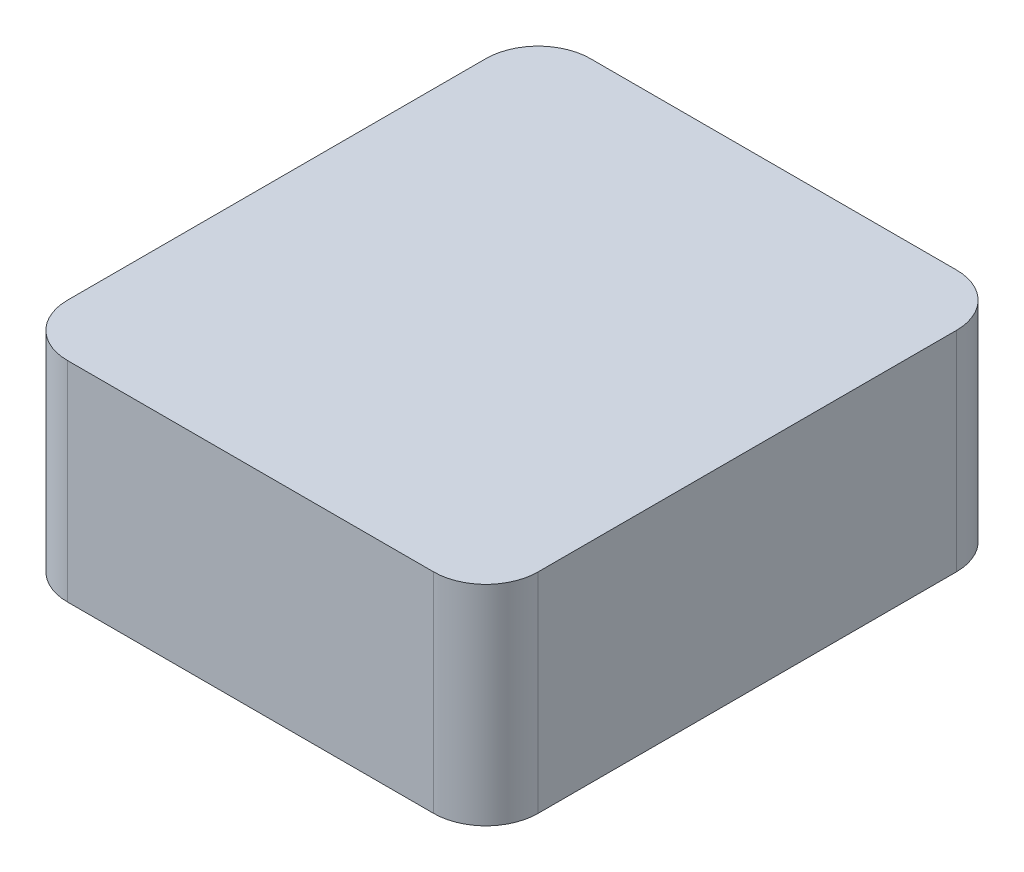
ISO-10303-21;
HEADER;
FILE_DESCRIPTION(('STEP AP214'),'2;1');
FILE_NAME('part.step','',(''),(''),'','','');
FILE_SCHEMA(('AUTOMOTIVE_DESIGN { 1 0 10303 214 1 1 1 1 }'));
ENDSEC;
DATA;
#1=APPLICATION_CONTEXT('core data for automotive mechanical design processes');
#2=APPLICATION_PROTOCOL_DEFINITION('international standard','automotive_design',2000,#1);
#3=PRODUCT_CONTEXT('',#1,'mechanical');
#4=PRODUCT('Part','Part','',(#3));
#5=PRODUCT_RELATED_PRODUCT_CATEGORY('part','',(#4));
#6=PRODUCT_DEFINITION_FORMATION('','',#4);
#7=PRODUCT_DEFINITION_CONTEXT('part definition',#1,'design');
#8=PRODUCT_DEFINITION('design','',#6,#7);
#9=PRODUCT_DEFINITION_SHAPE('','',#8);
#10=(LENGTH_UNIT() NAMED_UNIT(*) SI_UNIT(.MILLI.,.METRE.));
#11=(NAMED_UNIT(*) PLANE_ANGLE_UNIT() SI_UNIT($,.RADIAN.));
#12=(NAMED_UNIT(*) SI_UNIT($,.STERADIAN.) SOLID_ANGLE_UNIT());
#13=UNCERTAINTY_MEASURE_WITH_UNIT(LENGTH_MEASURE(1.E-05),#10,'distance_accuracy_value','');
#14=(GEOMETRIC_REPRESENTATION_CONTEXT(3) GLOBAL_UNCERTAINTY_ASSIGNED_CONTEXT((#13)) GLOBAL_UNIT_ASSIGNED_CONTEXT((#10,
#11,#12)) REPRESENTATION_CONTEXT('',''));
#15=CARTESIAN_POINT('',(0.,0.,0.));
#16=DIRECTION('',(0.,0.,1.));
#17=DIRECTION('',(1.,0.,0.));
#18=AXIS2_PLACEMENT_3D('',#15,#16,#17);
#19=CARTESIAN_POINT('',(1.91373049366322,40.,-7.31171737839826));
#20=DIRECTION('',(0.,-1.,0.));
#21=DIRECTION('',(0.,0.,-1.));
#22=AXIS2_PLACEMENT_3D('',#19,#20,#21);
#23=CYLINDRICAL_SURFACE('',#22,10.);
#24=DIRECTION('',(0.,-1.,0.));
#25=VECTOR('',#24,1.);
#26=CARTESIAN_POINT('',(-8.08626950633678,40.,-7.31171737839826));
#27=LINE('',#26,#25);
#28=CARTESIAN_POINT('',(-8.08626950633678,40.,-7.31171737839826));
#29=VERTEX_POINT('',#28);
#30=CARTESIAN_POINT('',(-8.08626950633678,0.,-7.31171737839826));
#31=VERTEX_POINT('',#30);
#32=EDGE_CURVE('E213',#29,#31,#27,.T.);
#33=ORIENTED_EDGE('',*,*,#32,.F.);
#34=CARTESIAN_POINT('',(1.91373049366322,40.,-7.31171737839826));
#35=DIRECTION('',(0.,1.,0.));
#36=DIRECTION('',(0.,0.,1.));
#37=AXIS2_PLACEMENT_3D('',#34,#35,#36);
#38=CIRCLE('',#37,10.);
#39=CARTESIAN_POINT('',(1.91373049366322,40.,-17.3117173783983));
#40=VERTEX_POINT('',#39);
#41=EDGE_CURVE('E40',#40,#29,#38,.T.);
#42=ORIENTED_EDGE('',*,*,#41,.F.);
#43=DIRECTION('',(0.,-1.,0.));
#44=VECTOR('',#43,1.);
#45=CARTESIAN_POINT('',(1.91373049366322,40.,-17.3117173783983));
#46=LINE('',#45,#44);
#47=CARTESIAN_POINT('',(1.91373049366322,0.,-17.3117173783983));
#48=VERTEX_POINT('',#47);
#49=EDGE_CURVE('E216',#48,#40,#46,.F.);
#50=ORIENTED_EDGE('',*,*,#49,.F.);
#51=CARTESIAN_POINT('',(1.91373049366322,0.,-7.31171737839826));
#52=DIRECTION('',(0.,1.,0.));
#53=DIRECTION('',(0.,0.,1.));
#54=AXIS2_PLACEMENT_3D('',#51,#52,#53);
#55=CIRCLE('',#54,10.);
#56=EDGE_CURVE('E11',#31,#48,#55,.F.);
#57=ORIENTED_EDGE('',*,*,#56,.F.);
#58=EDGE_LOOP('',(#33,#42,#50,#57));
#59=FACE_BOUND('',#58,.T.);
#60=ADVANCED_FACE('F33',(#59),#23,.T.);
#61=CARTESIAN_POINT('',(71.9137304936632,40.,-7.31171737839826));
#62=DIRECTION('',(0.,1.,0.));
#63=DIRECTION('',(0.,0.,1.));
#64=AXIS2_PLACEMENT_3D('',#61,#62,#63);
#65=CYLINDRICAL_SURFACE('',#64,10.);
#66=DIRECTION('',(0.,1.,0.));
#67=VECTOR('',#66,1.);
#68=CARTESIAN_POINT('',(81.9137304936632,40.,-7.31171737839826));
#69=LINE('',#68,#67);
#70=CARTESIAN_POINT('',(81.9137304936632,0.,-7.31171737839826));
#71=VERTEX_POINT('',#70);
#72=CARTESIAN_POINT('',(81.9137304936632,40.,-7.31171737839826));
#73=VERTEX_POINT('',#72);
#74=EDGE_CURVE('E203',#71,#73,#69,.T.);
#75=ORIENTED_EDGE('',*,*,#74,.F.);
#76=CARTESIAN_POINT('',(71.9137304936632,0.,-7.31171737839826));
#77=DIRECTION('',(0.,1.,0.));
#78=DIRECTION('',(0.,0.,1.));
#79=AXIS2_PLACEMENT_3D('',#76,#77,#78);
#80=CIRCLE('',#79,10.);
#81=CARTESIAN_POINT('',(71.9137304936632,0.,-17.3117173783983));
#82=VERTEX_POINT('',#81);
#83=EDGE_CURVE('E209',#82,#71,#80,.F.);
#84=ORIENTED_EDGE('',*,*,#83,.F.);
#85=DIRECTION('',(0.,1.,0.));
#86=VECTOR('',#85,1.);
#87=CARTESIAN_POINT('',(71.9137304936632,40.,-17.3117173783983));
#88=LINE('',#87,#86);
#89=CARTESIAN_POINT('',(71.9137304936632,40.,-17.3117173783983));
#90=VERTEX_POINT('',#89);
#91=EDGE_CURVE('E206',#90,#82,#88,.F.);
#92=ORIENTED_EDGE('',*,*,#91,.F.);
#93=CARTESIAN_POINT('',(71.9137304936632,40.,-7.31171737839826));
#94=DIRECTION('',(0.,1.,0.));
#95=DIRECTION('',(0.,0.,1.));
#96=AXIS2_PLACEMENT_3D('',#93,#94,#95);
#97=CIRCLE('',#96,10.);
#98=EDGE_CURVE('E211',#73,#90,#97,.T.);
#99=ORIENTED_EDGE('',*,*,#98,.F.);
#100=EDGE_LOOP('',(#75,#84,#92,#99));
#101=FACE_BOUND('',#100,.T.);
#102=ADVANCED_FACE('F245',(#101),#65,.T.);
#103=CARTESIAN_POINT('',(1.91373049366323,40.,72.6882826216017));
#104=DIRECTION('',(0.,-1.,0.));
#105=DIRECTION('',(0.,0.,-1.));
#106=AXIS2_PLACEMENT_3D('',#103,#104,#105);
#107=CYLINDRICAL_SURFACE('',#106,10.);
#108=DIRECTION('',(0.,-1.,0.));
#109=VECTOR('',#108,1.);
#110=CARTESIAN_POINT('',(1.91373049366323,40.,82.6882826216017));
#111=LINE('',#110,#109);
#112=CARTESIAN_POINT('',(1.91373049366323,40.,82.6882826216017));
#113=VERTEX_POINT('',#112);
#114=CARTESIAN_POINT('',(1.91373049366323,0.,82.6882826216017));
#115=VERTEX_POINT('',#114);
#116=EDGE_CURVE('E192',#113,#115,#111,.T.);
#117=ORIENTED_EDGE('',*,*,#116,.F.);
#118=CARTESIAN_POINT('',(1.91373049366323,40.,72.6882826216017));
#119=DIRECTION('',(0.,1.,0.));
#120=DIRECTION('',(0.,0.,1.));
#121=AXIS2_PLACEMENT_3D('',#118,#119,#120);
#122=CIRCLE('',#121,10.);
#123=CARTESIAN_POINT('',(-8.08626950633677,40.,72.6882826216017));
#124=VERTEX_POINT('',#123);
#125=EDGE_CURVE('E198',#124,#113,#122,.T.);
#126=ORIENTED_EDGE('',*,*,#125,.F.);
#127=DIRECTION('',(0.,-1.,0.));
#128=VECTOR('',#127,1.);
#129=CARTESIAN_POINT('',(-8.08626950633677,40.,72.6882826216017));
#130=LINE('',#129,#128);
#131=CARTESIAN_POINT('',(-8.08626950633677,0.,72.6882826216017));
#132=VERTEX_POINT('',#131);
#133=EDGE_CURVE('E195',#132,#124,#130,.F.);
#134=ORIENTED_EDGE('',*,*,#133,.F.);
#135=CARTESIAN_POINT('',(1.91373049366323,0.,72.6882826216017));
#136=DIRECTION('',(0.,1.,0.));
#137=DIRECTION('',(0.,0.,1.));
#138=AXIS2_PLACEMENT_3D('',#135,#136,#137);
#139=CIRCLE('',#138,10.);
#140=EDGE_CURVE('E200',#115,#132,#139,.F.);
#141=ORIENTED_EDGE('',*,*,#140,.F.);
#142=EDGE_LOOP('',(#117,#126,#134,#141));
#143=FACE_BOUND('',#142,.T.);
#144=ADVANCED_FACE('F227',(#143),#107,.T.);
#145=CARTESIAN_POINT('',(71.9137304936632,40.,72.6882826216017));
#146=DIRECTION('',(0.,1.,0.));
#147=DIRECTION('',(0.,0.,1.));
#148=AXIS2_PLACEMENT_3D('',#145,#146,#147);
#149=CYLINDRICAL_SURFACE('',#148,10.);
#150=DIRECTION('',(0.,1.,0.));
#151=VECTOR('',#150,1.);
#152=CARTESIAN_POINT('',(71.9137304936632,40.,82.6882826216017));
#153=LINE('',#152,#151);
#154=CARTESIAN_POINT('',(71.9137304936632,0.,82.6882826216017));
#155=VERTEX_POINT('',#154);
#156=CARTESIAN_POINT('',(71.9137304936632,40.,82.6882826216017));
#157=VERTEX_POINT('',#156);
#158=EDGE_CURVE('E174',#155,#157,#153,.T.);
#159=ORIENTED_EDGE('',*,*,#158,.F.);
#160=CARTESIAN_POINT('',(71.9137304936632,0.,72.6882826216017));
#161=DIRECTION('',(0.,1.,0.));
#162=DIRECTION('',(0.,0.,1.));
#163=AXIS2_PLACEMENT_3D('',#160,#161,#162);
#164=CIRCLE('',#163,10.);
#165=CARTESIAN_POINT('',(81.9137304936632,0.,72.6882826216017));
#166=VERTEX_POINT('',#165);
#167=EDGE_CURVE('E187',#166,#155,#164,.F.);
#168=ORIENTED_EDGE('',*,*,#167,.F.);
#169=DIRECTION('',(0.,1.,0.));
#170=VECTOR('',#169,1.);
#171=CARTESIAN_POINT('',(81.9137304936632,40.,72.6882826216017));
#172=LINE('',#171,#170);
#173=CARTESIAN_POINT('',(81.9137304936632,40.,72.6882826216017));
#174=VERTEX_POINT('',#173);
#175=EDGE_CURVE('E184',#174,#166,#172,.F.);
#176=ORIENTED_EDGE('',*,*,#175,.F.);
#177=CARTESIAN_POINT('',(71.9137304936632,40.,72.6882826216017));
#178=DIRECTION('',(0.,1.,0.));
#179=DIRECTION('',(0.,0.,1.));
#180=AXIS2_PLACEMENT_3D('',#177,#178,#179);
#181=CIRCLE('',#180,10.);
#182=EDGE_CURVE('E190',#157,#174,#181,.T.);
#183=ORIENTED_EDGE('',*,*,#182,.F.);
#184=EDGE_LOOP('',(#159,#168,#176,#183));
#185=FACE_BOUND('',#184,.T.);
#186=ADVANCED_FACE('F234',(#185),#149,.T.);
#187=CARTESIAN_POINT('',(-8.08626950633678,40.,-17.3117173783983));
#188=DIRECTION('',(1.,0.,0.));
#189=DIRECTION('',(0.,0.,-1.));
#190=AXIS2_PLACEMENT_3D('',#187,#188,#189);
#191=PLANE('',#190);
#192=DIRECTION('',(0.,0.,1.));
#193=VECTOR('',#192,1.);
#194=CARTESIAN_POINT('',(-8.08626950633678,40.,-17.3117173783983));
#195=LINE('',#194,#193);
#196=EDGE_CURVE('E164',#29,#124,#195,.T.);
#197=ORIENTED_EDGE('',*,*,#196,.F.);
#198=ORIENTED_EDGE('',*,*,#32,.T.);
#199=DIRECTION('',(0.,0.,1.));
#200=VECTOR('',#199,1.);
#201=CARTESIAN_POINT('',(-8.08626950633678,0.,-17.3117173783983));
#202=LINE('',#201,#200);
#203=EDGE_CURVE('E143',#31,#132,#202,.T.);
#204=ORIENTED_EDGE('',*,*,#203,.T.);
#205=ORIENTED_EDGE('',*,*,#133,.T.);
#206=EDGE_LOOP('',(#197,#198,#204,#205));
#207=FACE_BOUND('',#206,.T.);
#208=ADVANCED_FACE('F223',(#207),#191,.F.);
#209=CARTESIAN_POINT('',(-8.08626950633677,40.,82.6882826216017));
#210=DIRECTION('',(0.,0.,-1.));
#211=DIRECTION('',(-1.,0.,0.));
#212=AXIS2_PLACEMENT_3D('',#209,#210,#211);
#213=PLANE('',#212);
#214=DIRECTION('',(1.,0.,0.));
#215=VECTOR('',#214,1.);
#216=CARTESIAN_POINT('',(-8.08626950633677,40.,82.6882826216017));
#217=LINE('',#216,#215);
#218=EDGE_CURVE('E166',#113,#157,#217,.T.);
#219=ORIENTED_EDGE('',*,*,#218,.F.);
#220=ORIENTED_EDGE('',*,*,#116,.T.);
#221=DIRECTION('',(1.,0.,0.));
#222=VECTOR('',#221,1.);
#223=CARTESIAN_POINT('',(-8.08626950633677,0.,82.6882826216017));
#224=LINE('',#223,#222);
#225=EDGE_CURVE('E146',#115,#155,#224,.T.);
#226=ORIENTED_EDGE('',*,*,#225,.T.);
#227=ORIENTED_EDGE('',*,*,#158,.T.);
#228=EDGE_LOOP('',(#219,#220,#226,#227));
#229=FACE_BOUND('',#228,.T.);
#230=ADVANCED_FACE('F236',(#229),#213,.F.);
#231=CARTESIAN_POINT('',(81.9137304936632,40.,-17.3117173783983));
#232=DIRECTION('',(-1.,0.,0.));
#233=DIRECTION('',(0.,0.,1.));
#234=AXIS2_PLACEMENT_3D('',#231,#232,#233);
#235=PLANE('',#234);
#236=DIRECTION('',(0.,0.,-1.));
#237=VECTOR('',#236,1.);
#238=CARTESIAN_POINT('',(81.9137304936632,0.,-17.3117173783983));
#239=LINE('',#238,#237);
#240=EDGE_CURVE('E177',#166,#71,#239,.T.);
#241=ORIENTED_EDGE('',*,*,#240,.T.);
#242=ORIENTED_EDGE('',*,*,#74,.T.);
#243=DIRECTION('',(0.,0.,-1.));
#244=VECTOR('',#243,1.);
#245=CARTESIAN_POINT('',(81.9137304936632,40.,-17.3117173783983));
#246=LINE('',#245,#244);
#247=EDGE_CURVE('E169',#174,#73,#246,.T.);
#248=ORIENTED_EDGE('',*,*,#247,.F.);
#249=ORIENTED_EDGE('',*,*,#175,.T.);
#250=EDGE_LOOP('',(#241,#242,#248,#249));
#251=FACE_BOUND('',#250,.T.);
#252=ADVANCED_FACE('F241',(#251),#235,.F.);
#253=CARTESIAN_POINT('',(-8.08626950633678,40.,-17.3117173783983));
#254=DIRECTION('',(0.,0.,1.));
#255=DIRECTION('',(1.,0.,0.));
#256=AXIS2_PLACEMENT_3D('',#253,#254,#255);
#257=PLANE('',#256);
#258=DIRECTION('',(-1.,0.,0.));
#259=VECTOR('',#258,1.);
#260=CARTESIAN_POINT('',(-8.08626950633678,0.,-17.3117173783983));
#261=LINE('',#260,#259);
#262=EDGE_CURVE('E167',#82,#48,#261,.T.);
#263=ORIENTED_EDGE('',*,*,#262,.T.);
#264=ORIENTED_EDGE('',*,*,#49,.T.);
#265=DIRECTION('',(-1.,0.,0.));
#266=VECTOR('',#265,1.);
#267=CARTESIAN_POINT('',(-8.08626950633678,40.,-17.3117173783983));
#268=LINE('',#267,#266);
#269=EDGE_CURVE('E172',#90,#40,#268,.T.);
#270=ORIENTED_EDGE('',*,*,#269,.F.);
#271=ORIENTED_EDGE('',*,*,#91,.T.);
#272=EDGE_LOOP('',(#263,#264,#270,#271));
#273=FACE_BOUND('',#272,.T.);
#274=ADVANCED_FACE('F247',(#273),#257,.F.);
#275=CARTESIAN_POINT('',(0.,40.,0.));
#276=DIRECTION('',(0.,1.,0.));
#277=DIRECTION('',(0.,0.,1.));
#278=AXIS2_PLACEMENT_3D('',#275,#276,#277);
#279=PLANE('',#278);
#280=ORIENTED_EDGE('',*,*,#269,.T.);
#281=ORIENTED_EDGE('',*,*,#41,.T.);
#282=ORIENTED_EDGE('',*,*,#196,.T.);
#283=ORIENTED_EDGE('',*,*,#125,.T.);
#284=ORIENTED_EDGE('',*,*,#218,.T.);
#285=ORIENTED_EDGE('',*,*,#182,.T.);
#286=ORIENTED_EDGE('',*,*,#247,.T.);
#287=ORIENTED_EDGE('',*,*,#98,.T.);
#288=EDGE_LOOP('',(#280,#281,#282,#283,#284,#285,#286,#287));
#289=FACE_BOUND('',#288,.T.);
#290=ADVANCED_FACE('F218',(#289),#279,.T.);
#291=CARTESIAN_POINT('',(0.,0.,0.));
#292=DIRECTION('',(0.,1.,0.));
#293=DIRECTION('',(0.,0.,1.));
#294=AXIS2_PLACEMENT_3D('',#291,#292,#293);
#295=PLANE('',#294);
#296=DIRECTION('',(-1.,0.,0.));
#297=VECTOR('',#296,1.);
#298=CARTESIAN_POINT('',(-8.08626950633678,0.,-14.3117173783983));
#299=LINE('',#298,#297);
#300=CARTESIAN_POINT('',(78.9137304936632,0.,-14.3117173783983));
#301=VERTEX_POINT('',#300);
#302=CARTESIAN_POINT('',(-5.08626950633678,0.,-14.3117173783983));
#303=VERTEX_POINT('',#302);
#304=EDGE_CURVE('E138',#301,#303,#299,.T.);
#305=ORIENTED_EDGE('',*,*,#304,.T.);
#306=DIRECTION('',(0.,0.,1.));
#307=VECTOR('',#306,1.);
#308=CARTESIAN_POINT('',(-5.08626950633678,0.,-17.3117173783983));
#309=LINE('',#308,#307);
#310=CARTESIAN_POINT('',(-5.08626950633677,0.,79.6882826216017));
#311=VERTEX_POINT('',#310);
#312=EDGE_CURVE('E156',#303,#311,#309,.T.);
#313=ORIENTED_EDGE('',*,*,#312,.T.);
#314=DIRECTION('',(1.,0.,0.));
#315=VECTOR('',#314,1.);
#316=CARTESIAN_POINT('',(-8.08626950633677,0.,79.6882826216017));
#317=LINE('',#316,#315);
#318=CARTESIAN_POINT('',(78.9137304936632,0.,79.6882826216017));
#319=VERTEX_POINT('',#318);
#320=EDGE_CURVE('E142',#311,#319,#317,.T.);
#321=ORIENTED_EDGE('',*,*,#320,.T.);
#322=DIRECTION('',(0.,0.,-1.));
#323=VECTOR('',#322,1.);
#324=CARTESIAN_POINT('',(78.9137304936632,0.,-17.3117173783983));
#325=LINE('',#324,#323);
#326=EDGE_CURVE('E160',#319,#301,#325,.T.);
#327=ORIENTED_EDGE('',*,*,#326,.T.);
#328=EDGE_LOOP('',(#305,#313,#321,#327));
#329=FACE_BOUND('',#328,.T.);
#330=ORIENTED_EDGE('',*,*,#203,.F.);
#331=ORIENTED_EDGE('',*,*,#56,.T.);
#332=ORIENTED_EDGE('',*,*,#262,.F.);
#333=ORIENTED_EDGE('',*,*,#83,.T.);
#334=ORIENTED_EDGE('',*,*,#240,.F.);
#335=ORIENTED_EDGE('',*,*,#167,.T.);
#336=ORIENTED_EDGE('',*,*,#225,.F.);
#337=ORIENTED_EDGE('',*,*,#140,.T.);
#338=EDGE_LOOP('',(#330,#331,#332,#333,#334,#335,#336,#337));
#339=FACE_BOUND('',#338,.T.);
#340=ADVANCED_FACE('F239',(#329,#339),#295,.F.);
#341=CARTESIAN_POINT('',(-5.08626950633678,40.,-17.3117173783983));
#342=DIRECTION('',(1.,0.,0.));
#343=DIRECTION('',(0.,0.,-1.));
#344=AXIS2_PLACEMENT_3D('',#341,#342,#343);
#345=PLANE('',#344);
#346=ORIENTED_EDGE('',*,*,#312,.F.);
#347=DIRECTION('',(0.,-1.,0.));
#348=VECTOR('',#347,1.);
#349=CARTESIAN_POINT('',(-5.08626950633678,40.,-14.3117173783983));
#350=LINE('',#349,#348);
#351=CARTESIAN_POINT('',(-5.08626950633678,37.,-14.3117173783983));
#352=VERTEX_POINT('',#351);
#353=EDGE_CURVE('E137',#352,#303,#350,.T.);
#354=ORIENTED_EDGE('',*,*,#353,.F.);
#355=DIRECTION('',(0.,0.,1.));
#356=VECTOR('',#355,1.);
#357=CARTESIAN_POINT('',(-5.08626950633678,37.,-17.3117173783983));
#358=LINE('',#357,#356);
#359=CARTESIAN_POINT('',(-5.08626950633677,37.,79.6882826216017));
#360=VERTEX_POINT('',#359);
#361=EDGE_CURVE('E123',#352,#360,#358,.T.);
#362=ORIENTED_EDGE('',*,*,#361,.T.);
#363=DIRECTION('',(0.,-1.,0.));
#364=VECTOR('',#363,1.);
#365=CARTESIAN_POINT('',(-5.08626950633677,40.,79.6882826216017));
#366=LINE('',#365,#364);
#367=EDGE_CURVE('E135',#360,#311,#366,.T.);
#368=ORIENTED_EDGE('',*,*,#367,.T.);
#369=EDGE_LOOP('',(#346,#354,#362,#368));
#370=FACE_BOUND('',#369,.T.);
#371=ADVANCED_FACE('F134',(#370),#345,.T.);
#372=CARTESIAN_POINT('',(-8.08626950633677,40.,79.6882826216017));
#373=DIRECTION('',(0.,0.,-1.));
#374=DIRECTION('',(-1.,0.,0.));
#375=AXIS2_PLACEMENT_3D('',#372,#373,#374);
#376=PLANE('',#375);
#377=ORIENTED_EDGE('',*,*,#320,.F.);
#378=ORIENTED_EDGE('',*,*,#367,.F.);
#379=DIRECTION('',(1.,0.,0.));
#380=VECTOR('',#379,1.);
#381=CARTESIAN_POINT('',(-8.08626950633677,37.,79.6882826216017));
#382=LINE('',#381,#380);
#383=CARTESIAN_POINT('',(78.9137304936632,37.,79.6882826216017));
#384=VERTEX_POINT('',#383);
#385=EDGE_CURVE('E119',#360,#384,#382,.T.);
#386=ORIENTED_EDGE('',*,*,#385,.T.);
#387=DIRECTION('',(0.,-1.,0.));
#388=VECTOR('',#387,1.);
#389=CARTESIAN_POINT('',(78.9137304936632,40.,79.6882826216017));
#390=LINE('',#389,#388);
#391=EDGE_CURVE('E144',#384,#319,#390,.T.);
#392=ORIENTED_EDGE('',*,*,#391,.T.);
#393=EDGE_LOOP('',(#377,#378,#386,#392));
#394=FACE_BOUND('',#393,.T.);
#395=ADVANCED_FACE('F140',(#394),#376,.T.);
#396=CARTESIAN_POINT('',(78.9137304936632,40.,-17.3117173783983));
#397=DIRECTION('',(-1.,0.,0.));
#398=DIRECTION('',(0.,0.,1.));
#399=AXIS2_PLACEMENT_3D('',#396,#397,#398);
#400=PLANE('',#399);
#401=ORIENTED_EDGE('',*,*,#326,.F.);
#402=ORIENTED_EDGE('',*,*,#391,.F.);
#403=DIRECTION('',(0.,0.,-1.));
#404=VECTOR('',#403,1.);
#405=CARTESIAN_POINT('',(78.9137304936632,37.,-17.3117173783983));
#406=LINE('',#405,#404);
#407=CARTESIAN_POINT('',(78.9137304936632,37.,-14.3117173783983));
#408=VERTEX_POINT('',#407);
#409=EDGE_CURVE('E124',#384,#408,#406,.T.);
#410=ORIENTED_EDGE('',*,*,#409,.T.);
#411=DIRECTION('',(0.,-1.,0.));
#412=VECTOR('',#411,1.);
#413=CARTESIAN_POINT('',(78.9137304936632,40.,-14.3117173783983));
#414=LINE('',#413,#412);
#415=EDGE_CURVE('E148',#408,#301,#414,.T.);
#416=ORIENTED_EDGE('',*,*,#415,.T.);
#417=EDGE_LOOP('',(#401,#402,#410,#416));
#418=FACE_BOUND('',#417,.T.);
#419=ADVANCED_FACE('F322',(#418),#400,.T.);
#420=CARTESIAN_POINT('',(-8.08626950633678,40.,-14.3117173783983));
#421=DIRECTION('',(0.,0.,1.));
#422=DIRECTION('',(1.,0.,0.));
#423=AXIS2_PLACEMENT_3D('',#420,#421,#422);
#424=PLANE('',#423);
#425=ORIENTED_EDGE('',*,*,#304,.F.);
#426=ORIENTED_EDGE('',*,*,#415,.F.);
#427=DIRECTION('',(-1.,0.,0.));
#428=VECTOR('',#427,1.);
#429=CARTESIAN_POINT('',(-8.08626950633678,37.,-14.3117173783983));
#430=LINE('',#429,#428);
#431=EDGE_CURVE('E151',#408,#352,#430,.T.);
#432=ORIENTED_EDGE('',*,*,#431,.T.);
#433=ORIENTED_EDGE('',*,*,#353,.T.);
#434=EDGE_LOOP('',(#425,#426,#432,#433));
#435=FACE_BOUND('',#434,.T.);
#436=ADVANCED_FACE('F329',(#435),#424,.T.);
#437=CARTESIAN_POINT('',(0.,37.,0.));
#438=DIRECTION('',(0.,1.,0.));
#439=DIRECTION('',(0.,0.,1.));
#440=AXIS2_PLACEMENT_3D('',#437,#438,#439);
#441=PLANE('',#440);
#442=ORIENTED_EDGE('',*,*,#361,.F.);
#443=ORIENTED_EDGE('',*,*,#431,.F.);
#444=ORIENTED_EDGE('',*,*,#409,.F.);
#445=ORIENTED_EDGE('',*,*,#385,.F.);
#446=EDGE_LOOP('',(#442,#443,#444,#445));
#447=FACE_BOUND('',#446,.T.);
#448=ADVANCED_FACE('F121',(#447),#441,.F.);
#449=CLOSED_SHELL('',(#60,#102,#144,#186,#208,#230,#252,#274,#290,#340,#371,#395,#419,#436,#448));
#450=MANIFOLD_SOLID_BREP('B2',#449);
#451=ADVANCED_BREP_SHAPE_REPRESENTATION('',(#18,#450),#14);
#452=SHAPE_DEFINITION_REPRESENTATION(#9,#451);
ENDSEC;
END-ISO-10303-21;
